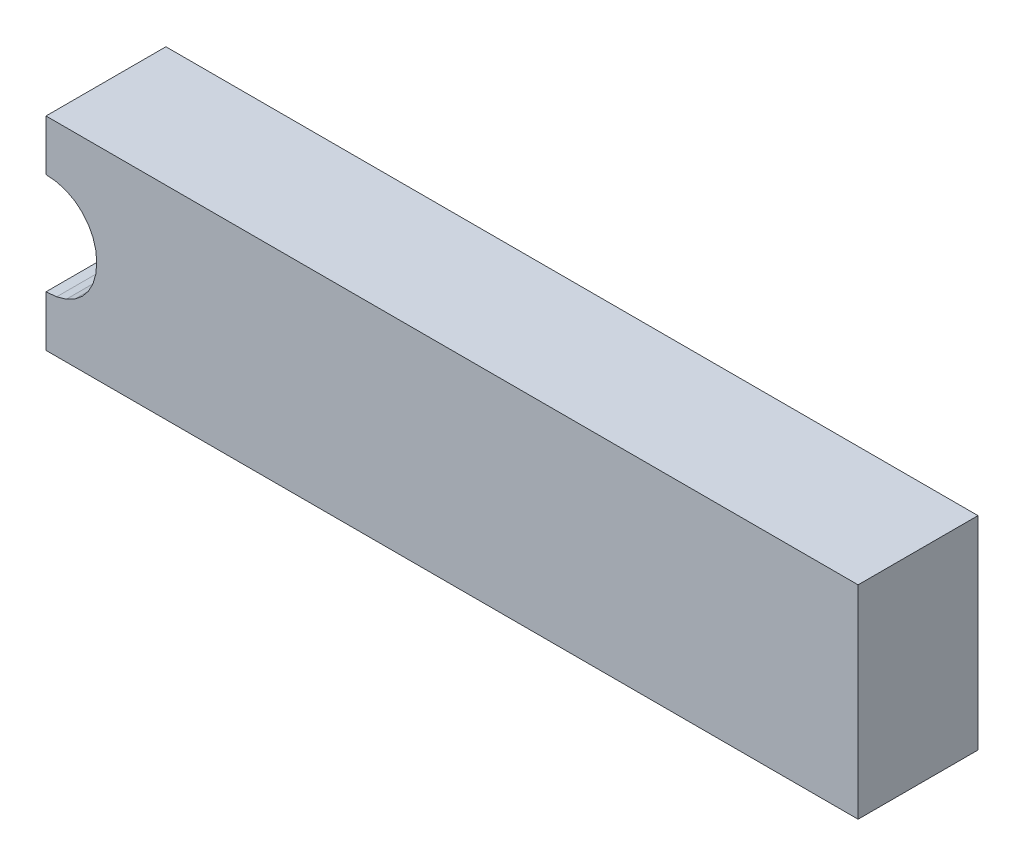
ISO-10303-21;
HEADER;
FILE_DESCRIPTION(('STEP AP214'),'2;1');
FILE_NAME('part.step','',(''),(''),'','','');
FILE_SCHEMA(('AUTOMOTIVE_DESIGN { 1 0 10303 214 1 1 1 1 }'));
ENDSEC;
DATA;
#1=APPLICATION_CONTEXT('core data for automotive mechanical design processes');
#2=APPLICATION_PROTOCOL_DEFINITION('international standard','automotive_design',2000,#1);
#3=PRODUCT_CONTEXT('',#1,'mechanical');
#4=PRODUCT('Part','Part','',(#3));
#5=PRODUCT_RELATED_PRODUCT_CATEGORY('part','',(#4));
#6=PRODUCT_DEFINITION_FORMATION('','',#4);
#7=PRODUCT_DEFINITION_CONTEXT('part definition',#1,'design');
#8=PRODUCT_DEFINITION('design','',#6,#7);
#9=PRODUCT_DEFINITION_SHAPE('','',#8);
#10=(LENGTH_UNIT() NAMED_UNIT(*) SI_UNIT(.MILLI.,.METRE.));
#11=(NAMED_UNIT(*) PLANE_ANGLE_UNIT() SI_UNIT($,.RADIAN.));
#12=(NAMED_UNIT(*) SI_UNIT($,.STERADIAN.) SOLID_ANGLE_UNIT());
#13=UNCERTAINTY_MEASURE_WITH_UNIT(LENGTH_MEASURE(1.E-05),#10,'distance_accuracy_value','');
#14=(GEOMETRIC_REPRESENTATION_CONTEXT(3) GLOBAL_UNCERTAINTY_ASSIGNED_CONTEXT((#13)) GLOBAL_UNIT_ASSIGNED_CONTEXT((#10,
#11,#12)) REPRESENTATION_CONTEXT('',''));
#15=CARTESIAN_POINT('',(0.,0.,0.));
#16=DIRECTION('',(0.,0.,1.));
#17=DIRECTION('',(1.,0.,0.));
#18=AXIS2_PLACEMENT_3D('',#15,#16,#17);
#19=CARTESIAN_POINT('',(0.,3.81,2.));
#20=DIRECTION('',(0.995834709059137,-0.0911769281841826,0.));
#21=DIRECTION('',(0.0911769281841826,0.995834709059137,0.));
#22=AXIS2_PLACEMENT_3D('',#19,#20,#21);
#23=PLANE('',#22);
#24=DIRECTION('',(0.,0.,1.));
#25=VECTOR('',#24,1.);
#26=CARTESIAN_POINT('',(-0.02436,3.54394,2.));
#27=LINE('',#26,#25);
#28=CARTESIAN_POINT('',(-0.0243600000000017,3.54394,2.));
#29=VERTEX_POINT('',#28);
#30=CARTESIAN_POINT('',(-0.0243600000000017,3.54394,5.));
#31=VERTEX_POINT('',#30);
#32=EDGE_CURVE('E175',#29,#31,#27,.T.);
#33=ORIENTED_EDGE('',*,*,#32,.T.);
#34=DIRECTION('',(0.0911769281841826,0.995834709059137,0.));
#35=VECTOR('',#34,1.);
#36=CARTESIAN_POINT('',(0.,3.81,5.));
#37=LINE('',#36,#35);
#38=CARTESIAN_POINT('',(0.,3.81,5.));
#39=VERTEX_POINT('',#38);
#40=EDGE_CURVE('E20',#39,#31,#37,.F.);
#41=ORIENTED_EDGE('',*,*,#40,.F.);
#42=DIRECTION('',(0.,0.,1.));
#43=VECTOR('',#42,1.);
#44=CARTESIAN_POINT('',(0.,3.81,2.));
#45=LINE('',#44,#43);
#46=CARTESIAN_POINT('',(0.,3.81,2.));
#47=VERTEX_POINT('',#46);
#48=EDGE_CURVE('E170',#39,#47,#45,.F.);
#49=ORIENTED_EDGE('',*,*,#48,.T.);
#50=DIRECTION('',(0.0911769281841826,0.995834709059137,0.));
#51=VECTOR('',#50,1.);
#52=CARTESIAN_POINT('',(0.,3.81,2.));
#53=LINE('',#52,#51);
#54=EDGE_CURVE('E154',#29,#47,#53,.T.);
#55=ORIENTED_EDGE('',*,*,#54,.F.);
#56=EDGE_LOOP('',(#33,#41,#49,#55));
#57=FACE_BOUND('',#56,.T.);
#58=ADVANCED_FACE('F17',(#57),#23,.F.);
#59=CARTESIAN_POINT('',(-0.02436,4.06876,2.));
#60=DIRECTION('',(0.99559794748133,0.0937268743262211,0.));
#61=DIRECTION('',(-0.0937268743262211,0.99559794748133,0.));
#62=AXIS2_PLACEMENT_3D('',#59,#60,#61);
#63=PLANE('',#62);
#64=ORIENTED_EDGE('',*,*,#48,.F.);
#65=DIRECTION('',(-0.0937268743262211,0.99559794748133,0.));
#66=VECTOR('',#65,1.);
#67=CARTESIAN_POINT('',(-0.02436,4.06876,5.));
#68=LINE('',#67,#66);
#69=CARTESIAN_POINT('',(-0.0243600000000003,4.06876,5.));
#70=VERTEX_POINT('',#69);
#71=EDGE_CURVE('E159',#70,#39,#68,.F.);
#72=ORIENTED_EDGE('',*,*,#71,.F.);
#73=DIRECTION('',(0.,0.,1.));
#74=VECTOR('',#73,1.);
#75=CARTESIAN_POINT('',(-0.0243599999999984,4.06876,2.));
#76=LINE('',#75,#74);
#77=CARTESIAN_POINT('',(-0.02436,4.06876,2.));
#78=VERTEX_POINT('',#77);
#79=EDGE_CURVE('E188',#70,#78,#76,.F.);
#80=ORIENTED_EDGE('',*,*,#79,.T.);
#81=DIRECTION('',(-0.0937268743262211,0.99559794748133,0.));
#82=VECTOR('',#81,1.);
#83=CARTESIAN_POINT('',(-0.02436,4.06876,2.));
#84=LINE('',#83,#82);
#85=EDGE_CURVE('E178',#47,#78,#84,.T.);
#86=ORIENTED_EDGE('',*,*,#85,.F.);
#87=EDGE_LOOP('',(#64,#72,#80,#86));
#88=FACE_BOUND('',#87,.T.);
#89=ADVANCED_FACE('F177',(#88),#63,.F.);
#90=CARTESIAN_POINT('',(-0.02436,3.54394,2.));
#91=DIRECTION('',(0.960447840727706,-0.278459952670915,0.));
#92=DIRECTION('',(0.278459952670915,0.960447840727706,0.));
#93=AXIS2_PLACEMENT_3D('',#90,#91,#92);
#94=PLANE('',#93);
#95=DIRECTION('',(0.,0.,1.));
#96=VECTOR('',#95,1.);
#97=CARTESIAN_POINT('',(-0.09485,3.30081,2.));
#98=LINE('',#97,#96);
#99=CARTESIAN_POINT('',(-0.0948499999999924,3.30081,2.));
#100=VERTEX_POINT('',#99);
#101=CARTESIAN_POINT('',(-0.0948499999999924,3.30081,5.));
#102=VERTEX_POINT('',#101);
#103=EDGE_CURVE('E192',#100,#102,#98,.T.);
#104=ORIENTED_EDGE('',*,*,#103,.T.);
#105=DIRECTION('',(0.278459952670915,0.960447840727706,0.));
#106=VECTOR('',#105,1.);
#107=CARTESIAN_POINT('',(-0.02436,3.54394,5.));
#108=LINE('',#107,#106);
#109=EDGE_CURVE('E183',#31,#102,#108,.F.);
#110=ORIENTED_EDGE('',*,*,#109,.F.);
#111=ORIENTED_EDGE('',*,*,#32,.F.);
#112=DIRECTION('',(0.278459952670915,0.960447840727706,0.));
#113=VECTOR('',#112,1.);
#114=CARTESIAN_POINT('',(-0.02436,3.54394,2.));
#115=LINE('',#114,#113);
#116=EDGE_CURVE('E185',#100,#29,#115,.T.);
#117=ORIENTED_EDGE('',*,*,#116,.F.);
#118=EDGE_LOOP('',(#104,#110,#111,#117));
#119=FACE_BOUND('',#118,.T.);
#120=ADVANCED_FACE('F353',(#119),#94,.F.);
#121=CARTESIAN_POINT('',(-0.09485,4.30848,2.));
#122=DIRECTION('',(0.959382706255781,0.282107821474936,0.));
#123=DIRECTION('',(-0.282107821474936,0.959382706255781,0.));
#124=AXIS2_PLACEMENT_3D('',#121,#122,#123);
#125=PLANE('',#124);
#126=ORIENTED_EDGE('',*,*,#79,.F.);
#127=DIRECTION('',(-0.282107821474936,0.959382706255781,0.));
#128=VECTOR('',#127,1.);
#129=CARTESIAN_POINT('',(-0.09485,4.30848,5.));
#130=LINE('',#129,#128);
#131=CARTESIAN_POINT('',(-0.0948499999999659,4.30848000000002,5.));
#132=VERTEX_POINT('',#131);
#133=EDGE_CURVE('E165',#132,#70,#130,.F.);
#134=ORIENTED_EDGE('',*,*,#133,.F.);
#135=DIRECTION('',(0.,0.,1.));
#136=VECTOR('',#135,1.);
#137=CARTESIAN_POINT('',(-0.0948499999998645,4.30848000000007,2.));
#138=LINE('',#137,#136);
#139=CARTESIAN_POINT('',(-0.094849999999966,4.30848000000002,2.));
#140=VERTEX_POINT('',#139);
#141=EDGE_CURVE('E202',#132,#140,#138,.F.);
#142=ORIENTED_EDGE('',*,*,#141,.T.);
#143=DIRECTION('',(-0.282107821474936,0.959382706255781,0.));
#144=VECTOR('',#143,1.);
#145=CARTESIAN_POINT('',(-0.09485,4.30848,2.));
#146=LINE('',#145,#144);
#147=EDGE_CURVE('E190',#78,#140,#146,.T.);
#148=ORIENTED_EDGE('',*,*,#147,.F.);
#149=EDGE_LOOP('',(#126,#134,#142,#148));
#150=FACE_BOUND('',#149,.T.);
#151=ADVANCED_FACE('F355',(#150),#125,.F.);
#152=CARTESIAN_POINT('',(-0.09485,3.30081,2.));
#153=DIRECTION('',(0.886766755198497,-0.462217180419259,0.));
#154=DIRECTION('',(0.462217180419259,0.886766755198497,0.));
#155=AXIS2_PLACEMENT_3D('',#152,#153,#154);
#156=PLANE('',#155);
#157=DIRECTION('',(0.,0.,1.));
#158=VECTOR('',#157,1.);
#159=CARTESIAN_POINT('',(-0.20762,3.08446,2.));
#160=LINE('',#159,#158);
#161=CARTESIAN_POINT('',(-0.207619999999988,3.08445999999999,2.));
#162=VERTEX_POINT('',#161);
#163=CARTESIAN_POINT('',(-0.207619999999988,3.08445999999999,5.));
#164=VERTEX_POINT('',#163);
#165=EDGE_CURVE('E207',#162,#164,#160,.T.);
#166=ORIENTED_EDGE('',*,*,#165,.T.);
#167=DIRECTION('',(0.462217180419259,0.886766755198497,0.));
#168=VECTOR('',#167,1.);
#169=CARTESIAN_POINT('',(-0.09485,3.30081,5.));
#170=LINE('',#169,#168);
#171=EDGE_CURVE('E195',#102,#164,#170,.F.);
#172=ORIENTED_EDGE('',*,*,#171,.F.);
#173=ORIENTED_EDGE('',*,*,#103,.F.);
#174=DIRECTION('',(0.462217180419259,0.886766755198497,0.));
#175=VECTOR('',#174,1.);
#176=CARTESIAN_POINT('',(-0.09485,3.30081,2.));
#177=LINE('',#176,#175);
#178=EDGE_CURVE('E197',#162,#100,#177,.T.);
#179=ORIENTED_EDGE('',*,*,#178,.F.);
#180=EDGE_LOOP('',(#166,#172,#173,#179));
#181=FACE_BOUND('',#180,.T.);
#182=ADVANCED_FACE('F351',(#181),#156,.F.);
#183=CARTESIAN_POINT('',(-0.20762,4.52438,2.));
#184=DIRECTION('',(0.88637173114919,0.462974247901099,0.));
#185=DIRECTION('',(-0.462974247901099,0.88637173114919,0.));
#186=AXIS2_PLACEMENT_3D('',#183,#184,#185);
#187=PLANE('',#186);
#188=ORIENTED_EDGE('',*,*,#141,.F.);
#189=DIRECTION('',(-0.462974247901099,0.88637173114919,0.));
#190=VECTOR('',#189,1.);
#191=CARTESIAN_POINT('',(-0.20762,4.52438,5.));
#192=LINE('',#191,#190);
#193=CARTESIAN_POINT('',(-0.207620000000022,4.52437999999998,5.));
#194=VERTEX_POINT('',#193);
#195=EDGE_CURVE('E200',#194,#132,#192,.F.);
#196=ORIENTED_EDGE('',*,*,#195,.F.);
#197=DIRECTION('',(0.,0.,1.));
#198=VECTOR('',#197,1.);
#199=CARTESIAN_POINT('',(-0.207620000000092,4.52437999999993,2.));
#200=LINE('',#199,#198);
#201=CARTESIAN_POINT('',(-0.207620000000023,4.52437999999998,2.));
#202=VERTEX_POINT('',#201);
#203=EDGE_CURVE('E217',#194,#202,#200,.F.);
#204=ORIENTED_EDGE('',*,*,#203,.T.);
#205=DIRECTION('',(-0.462974247901099,0.88637173114919,0.));
#206=VECTOR('',#205,1.);
#207=CARTESIAN_POINT('',(-0.20762,4.52438,2.));
#208=LINE('',#207,#206);
#209=EDGE_CURVE('E205',#140,#202,#208,.T.);
#210=ORIENTED_EDGE('',*,*,#209,.F.);
#211=EDGE_LOOP('',(#188,#196,#204,#210));
#212=FACE_BOUND('',#211,.T.);
#213=ADVANCED_FACE('F417',(#212),#187,.F.);
#214=CARTESIAN_POINT('',(-0.20762,3.08446,2.));
#215=DIRECTION('',(0.775510642852973,-0.631334493609979,0.));
#216=DIRECTION('',(0.631334493609979,0.775510642852973,0.));
#217=AXIS2_PLACEMENT_3D('',#214,#215,#216);
#218=PLANE('',#217);
#219=DIRECTION('',(0.,0.,1.));
#220=VECTOR('',#219,1.);
#221=CARTESIAN_POINT('',(-0.35878,2.89878,2.));
#222=LINE('',#221,#220);
#223=CARTESIAN_POINT('',(-0.35877999999994,2.89877999999995,2.));
#224=VERTEX_POINT('',#223);
#225=CARTESIAN_POINT('',(-0.35877999999994,2.89877999999995,5.));
#226=VERTEX_POINT('',#225);
#227=EDGE_CURVE('E222',#224,#226,#222,.T.);
#228=ORIENTED_EDGE('',*,*,#227,.T.);
#229=DIRECTION('',(0.631334493609979,0.775510642852973,0.));
#230=VECTOR('',#229,1.);
#231=CARTESIAN_POINT('',(-0.20762,3.08446,5.));
#232=LINE('',#231,#230);
#233=EDGE_CURVE('E210',#164,#226,#232,.F.);
#234=ORIENTED_EDGE('',*,*,#233,.F.);
#235=ORIENTED_EDGE('',*,*,#165,.F.);
#236=DIRECTION('',(0.631334493609979,0.775510642852973,0.));
#237=VECTOR('',#236,1.);
#238=CARTESIAN_POINT('',(-0.20762,3.08446,2.));
#239=LINE('',#238,#237);
#240=EDGE_CURVE('E212',#224,#162,#239,.T.);
#241=ORIENTED_EDGE('',*,*,#240,.F.);
#242=EDGE_LOOP('',(#228,#234,#235,#241));
#243=FACE_BOUND('',#242,.T.);
#244=ADVANCED_FACE('F348',(#243),#218,.F.);
#245=CARTESIAN_POINT('',(-0.35878,4.7117,2.));
#246=DIRECTION('',(0.778219161068091,0.627992784470074,0.));
#247=DIRECTION('',(-0.627992784470074,0.778219161068091,0.));
#248=AXIS2_PLACEMENT_3D('',#245,#246,#247);
#249=PLANE('',#248);
#250=ORIENTED_EDGE('',*,*,#203,.F.);
#251=DIRECTION('',(-0.627992784470074,0.778219161068091,0.));
#252=VECTOR('',#251,1.);
#253=CARTESIAN_POINT('',(-0.35878,4.7117,5.));
#254=LINE('',#253,#252);
#255=CARTESIAN_POINT('',(-0.358780000000002,4.7117,5.));
#256=VERTEX_POINT('',#255);
#257=EDGE_CURVE('E215',#256,#194,#254,.F.);
#258=ORIENTED_EDGE('',*,*,#257,.F.);
#259=DIRECTION('',(0.,0.,1.));
#260=VECTOR('',#259,1.);
#261=CARTESIAN_POINT('',(-0.35878000000001,4.71169999999999,2.));
#262=LINE('',#261,#260);
#263=CARTESIAN_POINT('',(-0.358780000000002,4.7117,2.));
#264=VERTEX_POINT('',#263);
#265=EDGE_CURVE('E232',#256,#264,#262,.F.);
#266=ORIENTED_EDGE('',*,*,#265,.T.);
#267=DIRECTION('',(-0.627992784470074,0.778219161068091,0.));
#268=VECTOR('',#267,1.);
#269=CARTESIAN_POINT('',(-0.35878,4.7117,2.));
#270=LINE('',#269,#268);
#271=EDGE_CURVE('E220',#202,#264,#270,.T.);
#272=ORIENTED_EDGE('',*,*,#271,.F.);
#273=EDGE_LOOP('',(#250,#258,#266,#272));
#274=FACE_BOUND('',#273,.T.);
#275=ADVANCED_FACE('F411',(#274),#249,.F.);
#276=CARTESIAN_POINT('',(-0.35878,2.89878,2.));
#277=DIRECTION('',(0.631334493609979,-0.775510642852973,0.));
#278=DIRECTION('',(0.775510642852973,0.631334493609979,0.));
#279=AXIS2_PLACEMENT_3D('',#276,#277,#278);
#280=PLANE('',#279);
#281=DIRECTION('',(0.,0.,1.));
#282=VECTOR('',#281,1.);
#283=CARTESIAN_POINT('',(-0.54446,2.74762,2.));
#284=LINE('',#283,#282);
#285=CARTESIAN_POINT('',(-0.544460000000049,2.74762000000006,2.));
#286=VERTEX_POINT('',#285);
#287=CARTESIAN_POINT('',(-0.544460000000049,2.74762000000006,5.));
#288=VERTEX_POINT('',#287);
#289=EDGE_CURVE('E237',#286,#288,#284,.T.);
#290=ORIENTED_EDGE('',*,*,#289,.T.);
#291=DIRECTION('',(0.775510642852973,0.631334493609979,0.));
#292=VECTOR('',#291,1.);
#293=CARTESIAN_POINT('',(-0.35878,2.89878,5.));
#294=LINE('',#293,#292);
#295=EDGE_CURVE('E225',#226,#288,#294,.F.);
#296=ORIENTED_EDGE('',*,*,#295,.F.);
#297=ORIENTED_EDGE('',*,*,#227,.F.);
#298=DIRECTION('',(0.775510642852973,0.631334493609979,0.));
#299=VECTOR('',#298,1.);
#300=CARTESIAN_POINT('',(-0.35878,2.89878,2.));
#301=LINE('',#300,#299);
#302=EDGE_CURVE('E227',#286,#224,#301,.T.);
#303=ORIENTED_EDGE('',*,*,#302,.F.);
#304=EDGE_LOOP('',(#290,#296,#297,#303));
#305=FACE_BOUND('',#304,.T.);
#306=ADVANCED_FACE('F342',(#305),#280,.F.);
#307=CARTESIAN_POINT('',(-0.54446,4.86569,2.));
#308=DIRECTION('',(0.638364026938038,0.769734609532046,0.));
#309=DIRECTION('',(-0.769734609532046,0.638364026938038,0.));
#310=AXIS2_PLACEMENT_3D('',#307,#308,#309);
#311=PLANE('',#310);
#312=ORIENTED_EDGE('',*,*,#265,.F.);
#313=DIRECTION('',(-0.769734609532046,0.638364026938038,0.));
#314=VECTOR('',#313,1.);
#315=CARTESIAN_POINT('',(-0.54446,4.86569,5.));
#316=LINE('',#315,#314);
#317=CARTESIAN_POINT('',(-0.544459999999996,4.86569000000001,5.));
#318=VERTEX_POINT('',#317);
#319=EDGE_CURVE('E230',#318,#256,#316,.F.);
#320=ORIENTED_EDGE('',*,*,#319,.F.);
#321=DIRECTION('',(0.,0.,1.));
#322=VECTOR('',#321,1.);
#323=CARTESIAN_POINT('',(-0.544459999999987,4.86569000000002,2.));
#324=LINE('',#323,#322);
#325=CARTESIAN_POINT('',(-0.544459999999997,4.86569000000001,2.));
#326=VERTEX_POINT('',#325);
#327=EDGE_CURVE('E247',#318,#326,#324,.F.);
#328=ORIENTED_EDGE('',*,*,#327,.T.);
#329=DIRECTION('',(-0.769734609532046,0.638364026938038,0.));
#330=VECTOR('',#329,1.);
#331=CARTESIAN_POINT('',(-0.54446,4.86569,2.));
#332=LINE('',#331,#330);
#333=EDGE_CURVE('E235',#264,#326,#332,.T.);
#334=ORIENTED_EDGE('',*,*,#333,.F.);
#335=EDGE_LOOP('',(#312,#320,#328,#334));
#336=FACE_BOUND('',#335,.T.);
#337=ADVANCED_FACE('F405',(#336),#311,.F.);
#338=CARTESIAN_POINT('',(-0.54446,2.74762,2.));
#339=DIRECTION('',(0.462217180419259,-0.886766755198497,0.));
#340=DIRECTION('',(0.886766755198497,0.462217180419259,0.));
#341=AXIS2_PLACEMENT_3D('',#338,#339,#340);
#342=PLANE('',#341);
#343=DIRECTION('',(0.,0.,1.));
#344=VECTOR('',#343,1.);
#345=CARTESIAN_POINT('',(-0.76081,2.63485,2.));
#346=LINE('',#345,#344);
#347=CARTESIAN_POINT('',(-0.760810000000007,2.63485000000001,2.));
#348=VERTEX_POINT('',#347);
#349=CARTESIAN_POINT('',(-0.760810000000007,2.63485000000001,5.));
#350=VERTEX_POINT('',#349);
#351=EDGE_CURVE('E252',#348,#350,#346,.T.);
#352=ORIENTED_EDGE('',*,*,#351,.T.);
#353=DIRECTION('',(0.886766755198497,0.462217180419259,0.));
#354=VECTOR('',#353,1.);
#355=CARTESIAN_POINT('',(-0.54446,2.74762,5.));
#356=LINE('',#355,#354);
#357=EDGE_CURVE('E240',#288,#350,#356,.F.);
#358=ORIENTED_EDGE('',*,*,#357,.F.);
#359=ORIENTED_EDGE('',*,*,#289,.F.);
#360=DIRECTION('',(0.886766755198497,0.462217180419259,0.));
#361=VECTOR('',#360,1.);
#362=CARTESIAN_POINT('',(-0.54446,2.74762,2.));
#363=LINE('',#362,#361);
#364=EDGE_CURVE('E242',#348,#286,#363,.T.);
#365=ORIENTED_EDGE('',*,*,#364,.F.);
#366=EDGE_LOOP('',(#352,#358,#359,#365));
#367=FACE_BOUND('',#366,.T.);
#368=ADVANCED_FACE('F339',(#367),#342,.F.);
#369=CARTESIAN_POINT('',(-0.76081,4.98158,2.));
#370=DIRECTION('',(0.472184100292246,0.88149995770346,0.));
#371=DIRECTION('',(-0.88149995770346,0.472184100292246,0.));
#372=AXIS2_PLACEMENT_3D('',#369,#370,#371);
#373=PLANE('',#372);
#374=ORIENTED_EDGE('',*,*,#327,.F.);
#375=DIRECTION('',(-0.88149995770346,0.472184100292246,0.));
#376=VECTOR('',#375,1.);
#377=CARTESIAN_POINT('',(-0.76081,4.98158,5.));
#378=LINE('',#377,#376);
#379=CARTESIAN_POINT('',(-0.760810000000005,4.98157999999998,5.));
#380=VERTEX_POINT('',#379);
#381=EDGE_CURVE('E245',#380,#318,#378,.F.);
#382=ORIENTED_EDGE('',*,*,#381,.F.);
#383=DIRECTION('',(0.,0.,1.));
#384=VECTOR('',#383,1.);
#385=CARTESIAN_POINT('',(-0.760810000000019,4.98157999999994,2.));
#386=LINE('',#385,#384);
#387=CARTESIAN_POINT('',(-0.760810000000005,4.98157999999998,2.));
#388=VERTEX_POINT('',#387);
#389=EDGE_CURVE('E262',#380,#388,#386,.F.);
#390=ORIENTED_EDGE('',*,*,#389,.T.);
#391=DIRECTION('',(-0.88149995770346,0.472184100292246,0.));
#392=VECTOR('',#391,1.);
#393=CARTESIAN_POINT('',(-0.76081,4.98158,2.));
#394=LINE('',#393,#392);
#395=EDGE_CURVE('E250',#326,#388,#394,.T.);
#396=ORIENTED_EDGE('',*,*,#395,.F.);
#397=EDGE_LOOP('',(#374,#382,#390,#396));
#398=FACE_BOUND('',#397,.T.);
#399=ADVANCED_FACE('F399',(#398),#373,.F.);
#400=CARTESIAN_POINT('',(-0.76081,2.63485,2.));
#401=DIRECTION('',(0.278459952670915,-0.960447840727706,0.));
#402=DIRECTION('',(0.960447840727706,0.278459952670915,0.));
#403=AXIS2_PLACEMENT_3D('',#400,#401,#402);
#404=PLANE('',#403);
#405=DIRECTION('',(0.,0.,1.));
#406=VECTOR('',#405,1.);
#407=CARTESIAN_POINT('',(-1.00394,2.56436,2.));
#408=LINE('',#407,#406);
#409=CARTESIAN_POINT('',(-1.00394,2.56436000000001,2.));
#410=VERTEX_POINT('',#409);
#411=CARTESIAN_POINT('',(-1.00394,2.56436000000001,5.));
#412=VERTEX_POINT('',#411);
#413=EDGE_CURVE('E267',#410,#412,#408,.T.);
#414=ORIENTED_EDGE('',*,*,#413,.T.);
#415=DIRECTION('',(0.960447840727706,0.278459952670915,0.));
#416=VECTOR('',#415,1.);
#417=CARTESIAN_POINT('',(-0.76081,2.63485,5.));
#418=LINE('',#417,#416);
#419=EDGE_CURVE('E255',#350,#412,#418,.F.);
#420=ORIENTED_EDGE('',*,*,#419,.F.);
#421=ORIENTED_EDGE('',*,*,#351,.F.);
#422=DIRECTION('',(0.960447840727706,0.278459952670915,0.));
#423=VECTOR('',#422,1.);
#424=CARTESIAN_POINT('',(-0.76081,2.63485,2.));
#425=LINE('',#424,#423);
#426=EDGE_CURVE('E257',#410,#348,#425,.T.);
#427=ORIENTED_EDGE('',*,*,#426,.F.);
#428=EDGE_LOOP('',(#414,#420,#421,#427));
#429=FACE_BOUND('',#428,.T.);
#430=ADVANCED_FACE('F336',(#429),#404,.F.);
#431=CARTESIAN_POINT('',(-1.00394,5.0546,2.));
#432=DIRECTION('',(0.287640601910088,0.957738421560293,0.));
#433=DIRECTION('',(-0.957738421560293,0.287640601910088,0.));
#434=AXIS2_PLACEMENT_3D('',#431,#432,#433);
#435=PLANE('',#434);
#436=ORIENTED_EDGE('',*,*,#389,.F.);
#437=DIRECTION('',(-0.957738421560293,0.287640601910088,0.));
#438=VECTOR('',#437,1.);
#439=CARTESIAN_POINT('',(-1.00394,5.0546,5.));
#440=LINE('',#439,#438);
#441=CARTESIAN_POINT('',(-1.00394,5.0546,5.));
#442=VERTEX_POINT('',#441);
#443=EDGE_CURVE('E260',#442,#380,#440,.F.);
#444=ORIENTED_EDGE('',*,*,#443,.F.);
#445=DIRECTION('',(0.,0.,1.));
#446=VECTOR('',#445,1.);
#447=CARTESIAN_POINT('',(-1.00394,5.05460000000001,2.));
#448=LINE('',#447,#446);
#449=CARTESIAN_POINT('',(-1.00394,5.0546,2.));
#450=VERTEX_POINT('',#449);
#451=EDGE_CURVE('E275',#442,#450,#448,.F.);
#452=ORIENTED_EDGE('',*,*,#451,.T.);
#453=DIRECTION('',(-0.957738421560293,0.287640601910088,0.));
#454=VECTOR('',#453,1.);
#455=CARTESIAN_POINT('',(-1.00394,5.0546,2.));
#456=LINE('',#455,#454);
#457=EDGE_CURVE('E265',#388,#450,#456,.T.);
#458=ORIENTED_EDGE('',*,*,#457,.F.);
#459=EDGE_LOOP('',(#436,#444,#452,#458));
#460=FACE_BOUND('',#459,.T.);
#461=ADVANCED_FACE('F393',(#460),#435,.F.);
#462=CARTESIAN_POINT('',(-1.00394,2.56436,2.));
#463=DIRECTION('',(0.0911769281841826,-0.995834709059137,0.));
#464=DIRECTION('',(0.995834709059137,0.0911769281841826,0.));
#465=AXIS2_PLACEMENT_3D('',#462,#463,#464);
#466=PLANE('',#465);
#467=DIRECTION('',(0.,0.,-1.));
#468=VECTOR('',#467,1.);
#469=CARTESIAN_POINT('',(-1.27,2.54,2.));
#470=LINE('',#469,#468);
#471=CARTESIAN_POINT('',(-1.27,2.54,2.));
#472=VERTEX_POINT('',#471);
#473=CARTESIAN_POINT('',(-1.27,2.54,5.));
#474=VERTEX_POINT('',#473);
#475=EDGE_CURVE('E280',#472,#474,#470,.F.);
#476=ORIENTED_EDGE('',*,*,#475,.T.);
#477=DIRECTION('',(0.995834709059137,0.0911769281841826,0.));
#478=VECTOR('',#477,1.);
#479=CARTESIAN_POINT('',(-1.00394,2.56436,5.));
#480=LINE('',#479,#478);
#481=EDGE_CURVE('E270',#412,#474,#480,.F.);
#482=ORIENTED_EDGE('',*,*,#481,.F.);
#483=ORIENTED_EDGE('',*,*,#413,.F.);
#484=DIRECTION('',(0.995834709059137,0.0911769281841826,0.));
#485=VECTOR('',#484,1.);
#486=CARTESIAN_POINT('',(-1.00394,2.56436,2.));
#487=LINE('',#486,#485);
#488=EDGE_CURVE('E272',#472,#410,#487,.T.);
#489=ORIENTED_EDGE('',*,*,#488,.F.);
#490=EDGE_LOOP('',(#476,#482,#483,#489));
#491=FACE_BOUND('',#490,.T.);
#492=ADVANCED_FACE('F332',(#491),#466,.F.);
#493=CARTESIAN_POINT('',(-1.27,5.08,2.));
#494=DIRECTION('',(0.0950350959689192,0.995473922578677,0.));
#495=DIRECTION('',(-0.995473922578677,0.0950350959689192,0.));
#496=AXIS2_PLACEMENT_3D('',#493,#494,#495);
#497=PLANE('',#496);
#498=ORIENTED_EDGE('',*,*,#451,.F.);
#499=DIRECTION('',(-0.995473922578675,0.0950350959689477,0.));
#500=VECTOR('',#499,1.);
#501=CARTESIAN_POINT('',(-1.00394,5.0546,5.));
#502=LINE('',#501,#500);
#503=CARTESIAN_POINT('',(-1.27,5.08,5.));
#504=VERTEX_POINT('',#503);
#505=EDGE_CURVE('E289',#442,#504,#502,.T.);
#506=ORIENTED_EDGE('',*,*,#505,.T.);
#507=DIRECTION('',(0.,0.,-1.));
#508=VECTOR('',#507,1.);
#509=CARTESIAN_POINT('',(-1.27,5.08,2.));
#510=LINE('',#509,#508);
#511=CARTESIAN_POINT('',(-1.27,5.08,2.));
#512=VERTEX_POINT('',#511);
#513=EDGE_CURVE('E293',#504,#512,#510,.T.);
#514=ORIENTED_EDGE('',*,*,#513,.T.);
#515=DIRECTION('',(-0.995473922578677,0.0950350959689192,0.));
#516=VECTOR('',#515,1.);
#517=CARTESIAN_POINT('',(-1.27,5.08,2.));
#518=LINE('',#517,#516);
#519=EDGE_CURVE('E278',#450,#512,#518,.T.);
#520=ORIENTED_EDGE('',*,*,#519,.F.);
#521=EDGE_LOOP('',(#498,#506,#514,#520));
#522=FACE_BOUND('',#521,.T.);
#523=ADVANCED_FACE('F387',(#522),#497,.F.);
#524=CARTESIAN_POINT('',(-1.27,2.54,2.));
#525=DIRECTION('',(1.,0.,0.));
#526=DIRECTION('',(0.,0.,-1.));
#527=AXIS2_PLACEMENT_3D('',#524,#525,#526);
#528=PLANE('',#527);
#529=DIRECTION('',(0.,0.,1.));
#530=VECTOR('',#529,1.);
#531=CARTESIAN_POINT('',(-1.27,1.27,2.));
#532=LINE('',#531,#530);
#533=CARTESIAN_POINT('',(-1.27,1.27,2.));
#534=VERTEX_POINT('',#533);
#535=CARTESIAN_POINT('',(-1.27,1.27,5.));
#536=VERTEX_POINT('',#535);
#537=EDGE_CURVE('E299',#534,#536,#532,.T.);
#538=ORIENTED_EDGE('',*,*,#537,.T.);
#539=DIRECTION('',(0.,1.,0.));
#540=VECTOR('',#539,1.);
#541=CARTESIAN_POINT('',(-1.27,6.35,5.));
#542=LINE('',#541,#540);
#543=EDGE_CURVE('E286',#536,#474,#542,.T.);
#544=ORIENTED_EDGE('',*,*,#543,.T.);
#545=ORIENTED_EDGE('',*,*,#475,.F.);
#546=DIRECTION('',(0.,1.,0.));
#547=VECTOR('',#546,1.);
#548=CARTESIAN_POINT('',(-1.27,2.54,2.));
#549=LINE('',#548,#547);
#550=EDGE_CURVE('E283',#534,#472,#549,.T.);
#551=ORIENTED_EDGE('',*,*,#550,.F.);
#552=EDGE_LOOP('',(#538,#544,#545,#551));
#553=FACE_BOUND('',#552,.T.);
#554=ADVANCED_FACE('F326',(#553),#528,.F.);
#555=CARTESIAN_POINT('',(19.05,6.35,5.));
#556=DIRECTION('',(0.,0.,-1.));
#557=DIRECTION('',(-1.,0.,0.));
#558=AXIS2_PLACEMENT_3D('',#555,#556,#557);
#559=PLANE('',#558);
#560=DIRECTION('',(0.,1.,0.));
#561=VECTOR('',#560,1.);
#562=CARTESIAN_POINT('',(-1.27,6.35,5.));
#563=LINE('',#562,#561);
#564=CARTESIAN_POINT('',(-1.27,6.35,5.));
#565=VERTEX_POINT('',#564);
#566=EDGE_CURVE('E291',#565,#504,#563,.F.);
#567=ORIENTED_EDGE('',*,*,#566,.T.);
#568=ORIENTED_EDGE('',*,*,#505,.F.);
#569=ORIENTED_EDGE('',*,*,#443,.T.);
#570=ORIENTED_EDGE('',*,*,#381,.T.);
#571=ORIENTED_EDGE('',*,*,#319,.T.);
#572=ORIENTED_EDGE('',*,*,#257,.T.);
#573=ORIENTED_EDGE('',*,*,#195,.T.);
#574=ORIENTED_EDGE('',*,*,#133,.T.);
#575=ORIENTED_EDGE('',*,*,#71,.T.);
#576=ORIENTED_EDGE('',*,*,#40,.T.);
#577=ORIENTED_EDGE('',*,*,#109,.T.);
#578=ORIENTED_EDGE('',*,*,#171,.T.);
#579=ORIENTED_EDGE('',*,*,#233,.T.);
#580=ORIENTED_EDGE('',*,*,#295,.T.);
#581=ORIENTED_EDGE('',*,*,#357,.T.);
#582=ORIENTED_EDGE('',*,*,#419,.T.);
#583=ORIENTED_EDGE('',*,*,#481,.T.);
#584=ORIENTED_EDGE('',*,*,#543,.F.);
#585=DIRECTION('',(1.,0.,0.));
#586=VECTOR('',#585,1.);
#587=CARTESIAN_POINT('',(-1.27,1.27,5.));
#588=LINE('',#587,#586);
#589=CARTESIAN_POINT('',(19.05,1.27,5.));
#590=VERTEX_POINT('',#589);
#591=EDGE_CURVE('E301',#536,#590,#588,.T.);
#592=ORIENTED_EDGE('',*,*,#591,.T.);
#593=DIRECTION('',(0.,1.,0.));
#594=VECTOR('',#593,1.);
#595=CARTESIAN_POINT('',(19.05,1.27,5.));
#596=LINE('',#595,#594);
#597=CARTESIAN_POINT('',(19.05,6.35,5.));
#598=VERTEX_POINT('',#597);
#599=EDGE_CURVE('E297',#590,#598,#596,.T.);
#600=ORIENTED_EDGE('',*,*,#599,.T.);
#601=DIRECTION('',(1.,0.,0.));
#602=VECTOR('',#601,1.);
#603=CARTESIAN_POINT('',(19.05,6.35,5.));
#604=LINE('',#603,#602);
#605=EDGE_CURVE('E308',#598,#565,#604,.F.);
#606=ORIENTED_EDGE('',*,*,#605,.T.);
#607=EDGE_LOOP('',(#567,#568,#569,#570,#571,#572,#573,#574,#575,#576,#577,#578,#579,#580,#581,
#582,#583,#584,#592,#600,#606));
#608=FACE_BOUND('',#607,.T.);
#609=ADVANCED_FACE('F162',(#608),#559,.F.);
#610=CARTESIAN_POINT('',(-1.27,6.35,2.));
#611=DIRECTION('',(1.,0.,0.));
#612=DIRECTION('',(0.,0.,-1.));
#613=AXIS2_PLACEMENT_3D('',#610,#611,#612);
#614=PLANE('',#613);
#615=ORIENTED_EDGE('',*,*,#513,.F.);
#616=ORIENTED_EDGE('',*,*,#566,.F.);
#617=DIRECTION('',(0.,0.,-1.));
#618=VECTOR('',#617,1.);
#619=CARTESIAN_POINT('',(-1.27,6.35,2.));
#620=LINE('',#619,#618);
#621=CARTESIAN_POINT('',(-1.27,6.35,2.));
#622=VERTEX_POINT('',#621);
#623=EDGE_CURVE('E310',#565,#622,#620,.T.);
#624=ORIENTED_EDGE('',*,*,#623,.T.);
#625=DIRECTION('',(0.,1.,0.));
#626=VECTOR('',#625,1.);
#627=CARTESIAN_POINT('',(-1.27,6.35,2.));
#628=LINE('',#627,#626);
#629=EDGE_CURVE('E34',#512,#622,#628,.T.);
#630=ORIENTED_EDGE('',*,*,#629,.F.);
#631=EDGE_LOOP('',(#615,#616,#624,#630));
#632=FACE_BOUND('',#631,.T.);
#633=ADVANCED_FACE('F378',(#632),#614,.F.);
#634=CARTESIAN_POINT('',(19.05,1.27,2.));
#635=DIRECTION('',(-1.,0.,0.));
#636=DIRECTION('',(0.,0.,1.));
#637=AXIS2_PLACEMENT_3D('',#634,#635,#636);
#638=PLANE('',#637);
#639=DIRECTION('',(0.,0.,-1.));
#640=VECTOR('',#639,1.);
#641=CARTESIAN_POINT('',(19.05,6.35,2.));
#642=LINE('',#641,#640);
#643=CARTESIAN_POINT('',(19.05,6.35,2.));
#644=VERTEX_POINT('',#643);
#645=EDGE_CURVE('E305',#644,#598,#642,.F.);
#646=ORIENTED_EDGE('',*,*,#645,.T.);
#647=ORIENTED_EDGE('',*,*,#599,.F.);
#648=DIRECTION('',(0.,0.,1.));
#649=VECTOR('',#648,1.);
#650=CARTESIAN_POINT('',(19.05,1.27,2.));
#651=LINE('',#650,#649);
#652=CARTESIAN_POINT('',(19.05,1.27,2.));
#653=VERTEX_POINT('',#652);
#654=EDGE_CURVE('E303',#590,#653,#651,.F.);
#655=ORIENTED_EDGE('',*,*,#654,.T.);
#656=DIRECTION('',(0.,1.,0.));
#657=VECTOR('',#656,1.);
#658=CARTESIAN_POINT('',(19.05,6.35,2.));
#659=LINE('',#658,#657);
#660=EDGE_CURVE('E312',#644,#653,#659,.F.);
#661=ORIENTED_EDGE('',*,*,#660,.F.);
#662=EDGE_LOOP('',(#646,#647,#655,#661));
#663=FACE_BOUND('',#662,.T.);
#664=ADVANCED_FACE('F375',(#663),#638,.F.);
#665=CARTESIAN_POINT('',(-1.27,1.27,2.));
#666=DIRECTION('',(0.,1.,0.));
#667=DIRECTION('',(0.,0.,1.));
#668=AXIS2_PLACEMENT_3D('',#665,#666,#667);
#669=PLANE('',#668);
#670=ORIENTED_EDGE('',*,*,#654,.F.);
#671=ORIENTED_EDGE('',*,*,#591,.F.);
#672=ORIENTED_EDGE('',*,*,#537,.F.);
#673=DIRECTION('',(-1.,0.,0.));
#674=VECTOR('',#673,1.);
#675=CARTESIAN_POINT('',(19.05,1.27,2.));
#676=LINE('',#675,#674);
#677=EDGE_CURVE('E26',#653,#534,#676,.T.);
#678=ORIENTED_EDGE('',*,*,#677,.F.);
#679=EDGE_LOOP('',(#670,#671,#672,#678));
#680=FACE_BOUND('',#679,.T.);
#681=ADVANCED_FACE('F322',(#680),#669,.F.);
#682=CARTESIAN_POINT('',(19.05,6.35,2.));
#683=DIRECTION('',(0.,-1.,0.));
#684=DIRECTION('',(0.,0.,-1.));
#685=AXIS2_PLACEMENT_3D('',#682,#683,#684);
#686=PLANE('',#685);
#687=ORIENTED_EDGE('',*,*,#623,.F.);
#688=ORIENTED_EDGE('',*,*,#605,.F.);
#689=ORIENTED_EDGE('',*,*,#645,.F.);
#690=DIRECTION('',(-1.,0.,0.));
#691=VECTOR('',#690,1.);
#692=CARTESIAN_POINT('',(19.05,6.35,2.));
#693=LINE('',#692,#691);
#694=EDGE_CURVE('E11',#622,#644,#693,.F.);
#695=ORIENTED_EDGE('',*,*,#694,.F.);
#696=EDGE_LOOP('',(#687,#688,#689,#695));
#697=FACE_BOUND('',#696,.T.);
#698=ADVANCED_FACE('F365',(#697),#686,.F.);
#699=CARTESIAN_POINT('',(19.05,6.35,2.));
#700=DIRECTION('',(0.,0.,-1.));
#701=DIRECTION('',(-1.,0.,0.));
#702=AXIS2_PLACEMENT_3D('',#699,#700,#701);
#703=PLANE('',#702);
#704=ORIENTED_EDGE('',*,*,#629,.T.);
#705=ORIENTED_EDGE('',*,*,#694,.T.);
#706=ORIENTED_EDGE('',*,*,#660,.T.);
#707=ORIENTED_EDGE('',*,*,#677,.T.);
#708=ORIENTED_EDGE('',*,*,#550,.T.);
#709=ORIENTED_EDGE('',*,*,#488,.T.);
#710=ORIENTED_EDGE('',*,*,#426,.T.);
#711=ORIENTED_EDGE('',*,*,#364,.T.);
#712=ORIENTED_EDGE('',*,*,#302,.T.);
#713=ORIENTED_EDGE('',*,*,#240,.T.);
#714=ORIENTED_EDGE('',*,*,#178,.T.);
#715=ORIENTED_EDGE('',*,*,#116,.T.);
#716=ORIENTED_EDGE('',*,*,#54,.T.);
#717=ORIENTED_EDGE('',*,*,#85,.T.);
#718=ORIENTED_EDGE('',*,*,#147,.T.);
#719=ORIENTED_EDGE('',*,*,#209,.T.);
#720=ORIENTED_EDGE('',*,*,#271,.T.);
#721=ORIENTED_EDGE('',*,*,#333,.T.);
#722=ORIENTED_EDGE('',*,*,#395,.T.);
#723=ORIENTED_EDGE('',*,*,#457,.T.);
#724=ORIENTED_EDGE('',*,*,#519,.T.);
#725=EDGE_LOOP('',(#704,#705,#706,#707,#708,#709,#710,#711,#712,#713,#714,#715,#716,#717,#718,
#719,#720,#721,#722,#723,#724));
#726=FACE_BOUND('',#725,.T.);
#727=ADVANCED_FACE('F317',(#726),#703,.T.);
#728=CLOSED_SHELL('',(#58,#89,#120,#151,#182,#213,#244,#275,#306,#337,#368,#399,#430,#461,#492,
#523,#554,#609,#633,#664,#681,#698,#727));
#729=MANIFOLD_SOLID_BREP('B1',#728);
#730=ADVANCED_BREP_SHAPE_REPRESENTATION('',(#18,#729),#14);
#731=SHAPE_DEFINITION_REPRESENTATION(#9,#730);
ENDSEC;
END-ISO-10303-21;
